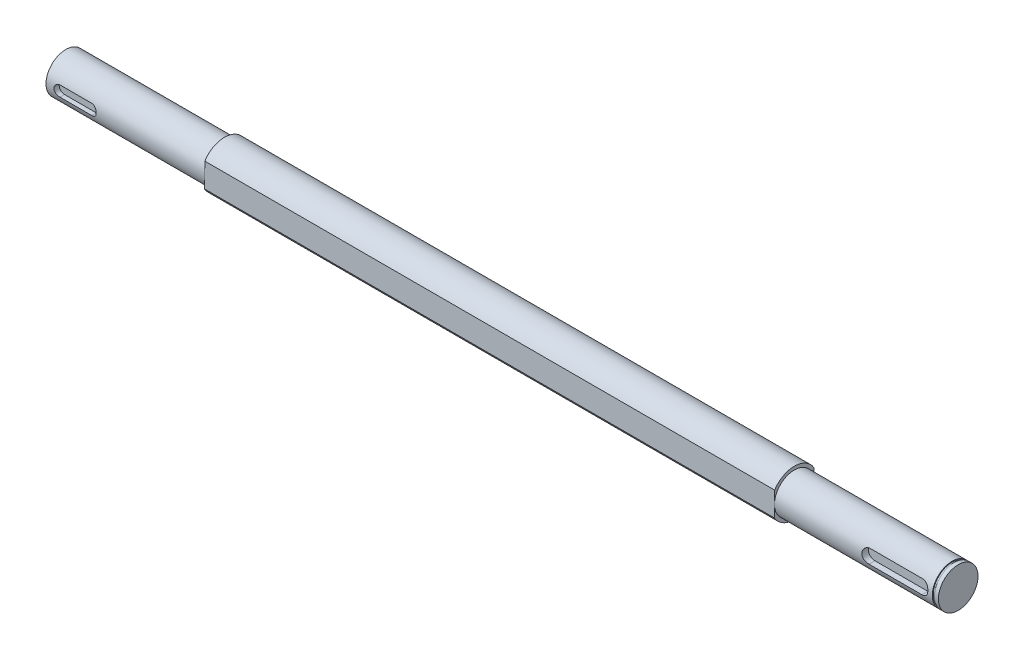
ISO-10303-21;
HEADER;
FILE_DESCRIPTION(('STEP AP214'),'2;1');
FILE_NAME('part.step','',(''),(''),'','','');
FILE_SCHEMA(('AUTOMOTIVE_DESIGN { 1 0 10303 214 1 1 1 1 }'));
ENDSEC;
DATA;
#1=APPLICATION_CONTEXT('core data for automotive mechanical design processes');
#2=APPLICATION_PROTOCOL_DEFINITION('international standard','automotive_design',2000,#1);
#3=PRODUCT_CONTEXT('',#1,'mechanical');
#4=PRODUCT('Part','Part','',(#3));
#5=PRODUCT_RELATED_PRODUCT_CATEGORY('part','',(#4));
#6=PRODUCT_DEFINITION_FORMATION('','',#4);
#7=PRODUCT_DEFINITION_CONTEXT('part definition',#1,'design');
#8=PRODUCT_DEFINITION('design','',#6,#7);
#9=PRODUCT_DEFINITION_SHAPE('','',#8);
#10=(LENGTH_UNIT() NAMED_UNIT(*) SI_UNIT(.MILLI.,.METRE.));
#11=(NAMED_UNIT(*) PLANE_ANGLE_UNIT() SI_UNIT($,.RADIAN.));
#12=(NAMED_UNIT(*) SI_UNIT($,.STERADIAN.) SOLID_ANGLE_UNIT());
#13=UNCERTAINTY_MEASURE_WITH_UNIT(LENGTH_MEASURE(1.E-05),#10,'distance_accuracy_value','');
#14=(GEOMETRIC_REPRESENTATION_CONTEXT(3) GLOBAL_UNCERTAINTY_ASSIGNED_CONTEXT((#13)) GLOBAL_UNIT_ASSIGNED_CONTEXT((#10,
#11,#12)) REPRESENTATION_CONTEXT('',''));
#15=CARTESIAN_POINT('',(0.,0.,0.));
#16=DIRECTION('',(0.,0.,1.));
#17=DIRECTION('',(1.,0.,0.));
#18=AXIS2_PLACEMENT_3D('',#15,#16,#17);
#19=CARTESIAN_POINT('',(-337.5,0.,0.));
#20=DIRECTION('',(-1.,0.,0.));
#21=DIRECTION('',(0.,0.,1.));
#22=AXIS2_PLACEMENT_3D('',#19,#20,#21);
#23=CYLINDRICAL_SURFACE('',#22,15.);
#24=DIRECTION('',(-1.,0.,0.));
#25=VECTOR('',#24,1.);
#26=CARTESIAN_POINT('',(-337.5,6.07346209048686,13.7154313907882));
#27=LINE('',#26,#25);
#28=CARTESIAN_POINT('',(284.5,6.07346209048698,13.7154313907882));
#29=VERTEX_POINT('',#28);
#30=CARTESIAN_POINT('',(324.5,6.07346209048699,13.7154313907882));
#31=VERTEX_POINT('',#30);
#32=EDGE_CURVE('E11',#29,#31,#27,.F.);
#33=ORIENTED_EDGE('',*,*,#32,.T.);
#34=CARTESIAN_POINT('',(324.5,6.07346209048699,13.7154313907882));
#35=CARTESIAN_POINT('',(324.63397390101,6.07348327762491,13.7154062533815));
#36=CARTESIAN_POINT('',(324.767936708805,6.06807834899583,13.7178149962337));
#37=CARTESIAN_POINT('',(325.034787208223,6.04657548103928,13.7273150361647));
#38=CARTESIAN_POINT('',(325.167675270867,6.03048140654111,13.7344046407987));
#39=CARTESIAN_POINT('',(325.430910167511,5.98784210482447,13.7530452271479));
#40=CARTESIAN_POINT('',(325.561264858577,5.96133765389236,13.7645787990248));
#41=CARTESIAN_POINT('',(325.819047565071,5.89816150830781,13.7917685576566));
#42=CARTESIAN_POINT('',(325.946475417137,5.86148924762141,13.8074249739244));
#43=CARTESIAN_POINT('',(326.197408000689,5.77837952891055,13.8424114610613));
#44=CARTESIAN_POINT('',(326.320917453775,5.73195438064666,13.8617368980857));
#45=CARTESIAN_POINT('',(326.563449660923,5.62972384677214,13.9035700128413));
#46=CARTESIAN_POINT('',(326.682470710043,5.57391493977371,13.9260788846957));
#47=CARTESIAN_POINT('',(327.031871185769,5.39299091630569,13.9975883158106));
#48=CARTESIAN_POINT('',(327.254620006512,5.25436778861608,14.0505763795512));
#49=CARTESIAN_POINT('',(327.685345247123,4.93724410614138,14.1652190662002));
#50=CARTESIAN_POINT('',(327.892006404643,4.75708243836331,14.2271763233824));
#51=CARTESIAN_POINT('',(328.273197368096,4.36550334842678,14.3521593684566));
#52=CARTESIAN_POINT('',(328.447718628643,4.15407764061873,14.4151854356743));
#53=CARTESIAN_POINT('',(328.686248174579,3.81137054542829,14.5082236522007));
#54=CARTESIAN_POINT('',(328.76348074474,3.68948929235013,14.5397492191822));
#55=CARTESIAN_POINT('',(328.907288704926,3.43917727179319,14.600980233659));
#56=CARTESIAN_POINT('',(328.973868145512,3.31074901823988,14.6306863702781));
#57=CARTESIAN_POINT('',(329.095833659755,3.04812354452185,14.6876481620985));
#58=CARTESIAN_POINT('',(329.15121679805,2.91392482265301,14.714903173645));
#59=CARTESIAN_POINT('',(329.250229626181,2.64075597247062,14.7663709045727));
#60=CARTESIAN_POINT('',(329.293864674975,2.50178805238237,14.7905850083829));
#61=CARTESIAN_POINT('',(329.367918565888,2.22388784242729,14.8348770546835));
#62=CARTESIAN_POINT('',(329.398665752866,2.08505819530652,14.8550498842601));
#63=CARTESIAN_POINT('',(329.448260534397,1.80486417807092,14.8916894990029));
#64=CARTESIAN_POINT('',(329.467113199592,1.66350091450559,14.9081578614567));
#65=CARTESIAN_POINT('',(329.492677109391,1.37928988887817,14.9371336286685));
#66=CARTESIAN_POINT('',(329.499389550553,1.23644227451168,14.9496414236852));
#67=CARTESIAN_POINT('',(329.500530779767,0.950399164494554,14.9705478223897));
#68=CARTESIAN_POINT('',(329.494960106692,0.80720368438044,14.9789466063241));
#69=CARTESIAN_POINT('',(329.472170592692,0.529554929067513,14.9912575695987));
#70=CARTESIAN_POINT('',(329.455613930798,0.395056693902908,14.995392463877));
#71=CARTESIAN_POINT('',(329.411615360571,0.127741225704569,15.0000518958352));
#72=CARTESIAN_POINT('',(329.384169785387,-0.00507542549082582,15.0005752162212));
#73=CARTESIAN_POINT('',(329.31860446569,-0.267953251567552,14.9981823472836));
#74=CARTESIAN_POINT('',(329.280489239476,-0.398015567809234,14.9952676122046));
#75=CARTESIAN_POINT('',(329.193853148098,-0.654565888931034,14.9862612394174));
#76=CARTESIAN_POINT('',(329.145328389829,-0.78105253644593,14.9801684118971));
#77=CARTESIAN_POINT('',(329.038726292522,-1.02842834374799,14.9652115340912));
#78=CARTESIAN_POINT('',(328.980737347695,-1.14935715173861,14.9563725010687));
#79=CARTESIAN_POINT('',(328.855309160377,-1.38605591592293,14.9362968441077));
#80=CARTESIAN_POINT('',(328.787866474987,-1.50182397231918,14.9250593459045));
#81=CARTESIAN_POINT('',(328.644033706292,-1.72740840446943,14.9006352525698));
#82=CARTESIAN_POINT('',(328.567645436313,-1.83722597984349,14.8874490523107));
#83=CARTESIAN_POINT('',(328.406392956105,-2.05031018947433,14.8596022727532));
#84=CARTESIAN_POINT('',(328.321525728456,-2.15357447006848,14.8449411685655));
#85=CARTESIAN_POINT('',(328.140651276199,-2.35652303884617,14.8141052412284));
#86=CARTESIAN_POINT('',(328.04435150837,-2.45594132518163,14.7978947897712));
#87=CARTESIAN_POINT('',(327.843886378942,-2.64642265254299,14.76501917081));
#88=CARTESIAN_POINT('',(327.73972084663,-2.73748551213487,14.7483539934422));
#89=CARTESIAN_POINT('',(327.5241390041,-2.91072082375132,14.7151448690884));
#90=CARTESIAN_POINT('',(327.412719217876,-2.99288896275022,14.6986009845097));
#91=CARTESIAN_POINT('',(327.183419867787,-3.14772131086452,14.6662233035419));
#92=CARTESIAN_POINT('',(327.065542542411,-3.22038878414664,14.6503892645045));
#93=CARTESIAN_POINT('',(326.821155725268,-3.35737561904632,14.619612757094));
#94=CARTESIAN_POINT('',(326.694507342702,-3.42145428825104,14.604700594995));
#95=CARTESIAN_POINT('',(326.436097774172,-3.53865734773634,14.5767463536471));
#96=CARTESIAN_POINT('',(326.304338569296,-3.59178593311977,14.5637035588077));
#97=CARTESIAN_POINT('',(326.036694844724,-3.68665437451773,14.539978453634));
#98=CARTESIAN_POINT('',(325.90081379756,-3.72840353663466,14.5292942158374));
#99=CARTESIAN_POINT('',(325.625865173295,-3.80020293341515,14.5106796930534));
#100=CARTESIAN_POINT('',(325.486798878599,-3.83025779158589,14.5027483198165));
#101=CARTESIAN_POINT('',(325.206888062657,-3.87834565476554,14.4899651215116));
#102=CARTESIAN_POINT('',(325.066050058997,-3.89641414305164,14.4851042090135));
#103=CARTESIAN_POINT('',(324.783476169546,-3.92051158837772,14.478591557935));
#104=CARTESIAN_POINT('',(324.641741834469,-3.92655752872573,14.4769352924912));
#105=CARTESIAN_POINT('',(324.5,-3.92653790951302,14.4769575548579));
#106=B_SPLINE_CURVE_WITH_KNOTS('',3,(#34,#35,#36,#37,#38,#39,#40,#41,#42,#43,#44,#45,#46,#47,
#48,#49,#50,#51,#52,#53,#54,#55,#56,#57,#58,#59,#60,#61,#62,#63,#64,#65,#66,#67,#68,#69,#70,#71,
#72,#73,#74,#75,#76,#77,#78,#79,#80,#81,#82,#83,#84,#85,#86,#87,#88,#89,#90,#91,#92,#93,#94,#95,
#96,#97,#98,#99,#100,#101,#102,#103,#104,#105),.UNSPECIFIED.,.F.,.F.,(4,2,2,2,2,2,2,2,2,2,2,2,2,
2,2,2,2,2,2,2,2,2,2,2,2,2,2,2,2,2,2,2,2,2,2,4),(0.,0.401773674154507,0.803402159724577,
1.20347295233272,1.60356602104035,2.00315710777569,2.40289848274697,3.20228002737228,
4.04205587850075,4.88205468867431,5.32468966588152,5.76715594131654,6.20973806924895,
6.65211796741768,7.08241831429803,7.51253509968848,7.94260948986661,8.37266501262683,
8.77890341007262,9.18527872494398,9.59148221091818,9.99783788031844,10.4005952221775,
10.8034996246409,11.206322496828,11.6092892363589,12.0268828614083,12.4444855521544,
12.8622898387131,13.2799501998937,13.7075807762128,14.135047216563,14.5621630183906,
14.9891097819882,15.4147869460964,15.8398623611671),.UNSPECIFIED.);
#107=CARTESIAN_POINT('',(324.5,-3.92653790951302,14.4769575548579));
#108=VERTEX_POINT('',#107);
#109=EDGE_CURVE('E299',#31,#108,#106,.T.);
#110=ORIENTED_EDGE('',*,*,#109,.T.);
#111=DIRECTION('',(-1.,0.,0.));
#112=VECTOR('',#111,1.);
#113=CARTESIAN_POINT('',(-337.5,-3.926537909513,14.4769575548579));
#114=LINE('',#113,#112);
#115=CARTESIAN_POINT('',(284.5,-3.926537909513,14.4769575548579));
#116=VERTEX_POINT('',#115);
#117=EDGE_CURVE('E41',#108,#116,#114,.T.);
#118=ORIENTED_EDGE('',*,*,#117,.T.);
#119=CARTESIAN_POINT('',(284.5,-3.92653790951301,14.4769575548579));
#120=CARTESIAN_POINT('',(284.361727269552,-3.92655559321679,14.4769374121292));
#121=CARTESIAN_POINT('',(284.223461239682,-3.92080285925546,14.4785126079107));
#122=CARTESIAN_POINT('',(283.947972881751,-3.89788777293455,14.4847067717097));
#123=CARTESIAN_POINT('',(283.810750353851,-3.88072766382228,14.489325141289));
#124=CARTESIAN_POINT('',(283.538619028268,-3.83517830673964,14.5014457212058));
#125=CARTESIAN_POINT('',(283.403705864787,-3.80681344874412,14.5089416667773));
#126=CARTESIAN_POINT('',(283.136840877484,-3.73909939940248,14.5265400633516));
#127=CARTESIAN_POINT('',(283.004889114713,-3.69974998182712,14.5366425680367));
#128=CARTESIAN_POINT('',(282.744900306645,-3.6103936282383,14.5590925215626));
#129=CARTESIAN_POINT('',(282.616861570745,-3.56039137134037,14.5714389844264));
#130=CARTESIAN_POINT('',(282.365470167761,-3.45010448620057,14.5979447565759));
#131=CARTESIAN_POINT('',(282.242119264388,-3.38981603388898,14.612104739579));
#132=CARTESIAN_POINT('',(281.880325765066,-3.19413027173053,14.656584323116));
#133=CARTESIAN_POINT('',(281.649963710719,-3.04385086351598,14.6889200615283));
#134=CARTESIAN_POINT('',(281.212268709328,-2.70402396012244,14.7552974648505));
#135=CARTESIAN_POINT('',(281.005566892805,-2.51367256445746,14.7893611153551));
#136=CARTESIAN_POINT('',(280.626579987665,-2.10067091683774,14.8536453825651));
#137=CARTESIAN_POINT('',(280.454297984271,-1.87801777259714,14.8838656546807));
#138=CARTESIAN_POINT('',(280.148168925702,-1.40473953029504,14.93598521089));
#139=CARTESIAN_POINT('',(280.014570848697,-1.15394704595174,14.9578308732902));
#140=CARTESIAN_POINT('',(279.791579084805,-0.632717591975507,14.9889190272426));
#141=CARTESIAN_POINT('',(279.702170573763,-0.362287245168827,14.9981657471599));
#142=CARTESIAN_POINT('',(279.572889591642,0.179909085188166,15.0012815453548));
#143=CARTESIAN_POINT('',(279.531342720391,0.451273131997974,14.9956946168802));
#144=CARTESIAN_POINT('',(279.493135633023,0.996388663949028,14.9693562813771));
#145=CARTESIAN_POINT('',(279.496470229669,1.27013986953643,14.9486066270634));
#146=CARTESIAN_POINT('',(279.546795253633,1.80601590119188,14.8932649280141));
#147=CARTESIAN_POINT('',(279.5928324717,2.06826408532214,14.8589844840154));
#148=CARTESIAN_POINT('',(279.725176924418,2.5804710316093,14.7786480434589));
#149=CARTESIAN_POINT('',(279.811489811818,2.83042806323992,14.7325903943637));
#150=CARTESIAN_POINT('',(280.024990950211,3.32024332718324,14.630129344542));
#151=CARTESIAN_POINT('',(280.153446368116,3.55948677753561,14.5734321450122));
#152=CARTESIAN_POINT('',(280.446544743179,4.01328763565505,14.4550553762692));
#153=CARTESIAN_POINT('',(280.611200778533,4.22783607907038,14.3933740115332));
#154=CARTESIAN_POINT('',(280.983047315308,4.63883873051916,14.2663924034092));
#155=CARTESIAN_POINT('',(281.192089745599,4.83363052536352,14.2010811000783));
#156=CARTESIAN_POINT('',(281.528828599302,5.09746160983885,14.1076098456609));
#157=CARTESIAN_POINT('',(281.645029365405,5.18072887207762,14.0771817779138));
#158=CARTESIAN_POINT('',(281.884522072694,5.33722825343147,14.0185933123181));
#159=CARTESIAN_POINT('',(282.007810929483,5.41046469125175,13.9904319407256));
#160=CARTESIAN_POINT('',(282.261012719932,5.54645213857724,13.937080903227));
#161=CARTESIAN_POINT('',(282.390939557256,5.60917985463073,13.9118978744393));
#162=CARTESIAN_POINT('',(282.656253753039,5.72334824134947,13.8653195340362));
#163=CARTESIAN_POINT('',(282.791638543552,5.77479414835522,13.8439224660989));
#164=CARTESIAN_POINT('',(283.066736988415,5.86582245161966,13.8055991420844));
#165=CARTESIAN_POINT('',(283.206444059161,5.90542199663724,13.7886664276804));
#166=CARTESIAN_POINT('',(283.489202891622,5.9723786625468,13.7597972592891));
#167=CARTESIAN_POINT('',(283.632252810433,5.99974236894941,13.7478581179106));
#168=CARTESIAN_POINT('',(283.896051575474,6.03832556667167,13.7309506152103));
#169=CARTESIAN_POINT('',(284.01646505765,6.05149678498338,13.7251431045586));
#170=CARTESIAN_POINT('',(284.257914186845,6.06906637397555,13.7173777140436));
#171=CARTESIAN_POINT('',(284.378948965867,6.07347475041513,13.7154154435694));
#172=CARTESIAN_POINT('',(284.5,6.07346209048698,13.7154313907882));
#173=B_SPLINE_CURVE_WITH_KNOTS('',3,(#119,#120,#121,#122,#123,#124,#125,#126,#127,#128,#129,
#130,#131,#132,#133,#134,#135,#136,#137,#138,#139,#140,#141,#142,#143,#144,#145,#146,#147,#148,
#149,#150,#151,#152,#153,#154,#155,#156,#157,#158,#159,#160,#161,#162,#163,#164,#165,#166,#167,
#168,#169,#170,#171,#172),.UNSPECIFIED.,.F.,.F.,(4,2,2,2,2,2,2,2,2,2,2,2,2,2,2,2,2,2,2,2,2,2,2,
2,2,2,4),(0.,0.414679204591292,0.829276887103151,1.24297702226714,1.65668567829824,
2.07021299166737,2.48389437724065,3.31069483290199,4.15600798358966,5.0013968700526,
5.85211170905448,6.70254096696643,7.52221707049838,8.34179843966596,9.14351429326244,
9.94534270270342,10.7739114656597,11.6027800589483,12.4775978429818,12.9156373850444,
13.3534877352184,13.7922961313973,14.2309004258789,14.6688666910368,15.106596951665,
15.4700395242264,15.8330668647638),.UNSPECIFIED.);
#174=EDGE_CURVE('E48',#116,#29,#173,.T.);
#175=ORIENTED_EDGE('',*,*,#174,.T.);
#176=EDGE_LOOP('',(#33,#110,#118,#175));
#177=FACE_BOUND('',#176,.T.);
#178=CARTESIAN_POINT('',(332.9,0.,0.));
#179=DIRECTION('',(1.,0.,0.));
#180=DIRECTION('',(0.,0.,-1.));
#181=AXIS2_PLACEMENT_3D('',#178,#179,#180);
#182=CIRCLE('',#181,15.);
#183=CARTESIAN_POINT('',(332.9,0.,-15.));
#184=VERTEX_POINT('',#183);
#185=EDGE_CURVE('E162',#184,#184,#182,.T.);
#186=ORIENTED_EDGE('',*,*,#185,.F.);
#187=EDGE_LOOP('',(#186));
#188=FACE_BOUND('',#187,.T.);
#189=CARTESIAN_POINT('',(213.5,0.,0.));
#190=DIRECTION('',(-1.,0.,0.));
#191=DIRECTION('',(0.,0.,1.));
#192=AXIS2_PLACEMENT_3D('',#189,#190,#191);
#193=CIRCLE('',#192,15.);
#194=CARTESIAN_POINT('',(213.5,0.25612963538557,14.997813094244));
#195=VERTEX_POINT('',#194);
#196=CARTESIAN_POINT('',(213.5,0.25612963538557,-14.997813094244));
#197=VERTEX_POINT('',#196);
#198=EDGE_CURVE('E226',#195,#197,#193,.T.);
#199=ORIENTED_EDGE('',*,*,#198,.F.);
#200=EDGE_CURVE('E225',#197,#195,#193,.T.);
#201=ORIENTED_EDGE('',*,*,#200,.F.);
#202=EDGE_LOOP('',(#199,#201));
#203=FACE_BOUND('',#202,.T.);
#204=ADVANCED_FACE('F33',(#177,#188,#203),#23,.T.);
#205=CARTESIAN_POINT('',(-217.5,15.,0.));
#206=DIRECTION('',(1.,0.,0.));
#207=DIRECTION('',(0.,0.,-1.));
#208=AXIS2_PLACEMENT_3D('',#205,#206,#207);
#209=PLANE('',#208);
#210=CARTESIAN_POINT('',(-217.5,0.,0.));
#211=DIRECTION('',(-1.,0.,0.));
#212=DIRECTION('',(0.,0.,1.));
#213=AXIS2_PLACEMENT_3D('',#210,#211,#212);
#214=CIRCLE('',#213,17.5);
#215=CARTESIAN_POINT('',(-217.5,9.26869365723926,14.8438983386526));
#216=VERTEX_POINT('',#215);
#217=CARTESIAN_POINT('',(-217.5,9.26869365723926,-14.8438983386526));
#218=VERTEX_POINT('',#217);
#219=EDGE_CURVE('E234',#216,#218,#214,.T.);
#220=ORIENTED_EDGE('',*,*,#219,.T.);
#221=DIRECTION('',(0.,0.999854206282934,0.0170753090257047));
#222=VECTOR('',#221,1.);
#223=CARTESIAN_POINT('',(-217.5,9.26869365723926,-14.8438983386526));
#224=LINE('',#223,#222);
#225=CARTESIAN_POINT('',(-217.5,0.25612963538557,-14.997813094244));
#226=VERTEX_POINT('',#225);
#227=EDGE_CURVE('E204',#226,#218,#224,.T.);
#228=ORIENTED_EDGE('',*,*,#227,.F.);
#229=CARTESIAN_POINT('',(-217.5,0.,0.));
#230=DIRECTION('',(-1.,0.,0.));
#231=DIRECTION('',(0.,0.,1.));
#232=AXIS2_PLACEMENT_3D('',#229,#230,#231);
#233=CIRCLE('',#232,15.);
#234=CARTESIAN_POINT('',(-217.5,0.25612963538557,14.997813094244));
#235=VERTEX_POINT('',#234);
#236=EDGE_CURVE('E238',#235,#226,#233,.T.);
#237=ORIENTED_EDGE('',*,*,#236,.F.);
#238=DIRECTION('',(0.,-0.999854206282934,0.0170753090257047));
#239=VECTOR('',#238,1.);
#240=CARTESIAN_POINT('',(-217.5,9.26869365723926,14.8438983386526));
#241=LINE('',#240,#239);
#242=EDGE_CURVE('E213',#216,#235,#241,.T.);
#243=ORIENTED_EDGE('',*,*,#242,.F.);
#244=EDGE_LOOP('',(#220,#228,#237,#243));
#245=FACE_BOUND('',#244,.T.);
#246=ADVANCED_FACE('F332',(#245),#209,.F.);
#247=CARTESIAN_POINT('',(-337.5,0.,0.));
#248=DIRECTION('',(-1.,0.,0.));
#249=DIRECTION('',(0.,0.,1.));
#250=AXIS2_PLACEMENT_3D('',#247,#248,#249);
#251=CYLINDRICAL_SURFACE('',#250,17.5);
#252=CARTESIAN_POINT('',(213.5,0.,0.));
#253=DIRECTION('',(-1.,0.,0.));
#254=DIRECTION('',(0.,0.,1.));
#255=AXIS2_PLACEMENT_3D('',#252,#253,#254);
#256=CIRCLE('',#255,17.5);
#257=CARTESIAN_POINT('',(213.5,9.26869365723933,14.8438983386526));
#258=VERTEX_POINT('',#257);
#259=CARTESIAN_POINT('',(213.5,9.26869365723927,-14.8438983386526));
#260=VERTEX_POINT('',#259);
#261=EDGE_CURVE('E230',#258,#260,#256,.T.);
#262=ORIENTED_EDGE('',*,*,#261,.T.);
#263=DIRECTION('',(-1.,0.,0.));
#264=VECTOR('',#263,1.);
#265=CARTESIAN_POINT('',(231.719772694176,9.26869365723933,-14.8438983386526));
#266=LINE('',#265,#264);
#267=EDGE_CURVE('E205',#260,#218,#266,.T.);
#268=ORIENTED_EDGE('',*,*,#267,.T.);
#269=ORIENTED_EDGE('',*,*,#219,.F.);
#270=DIRECTION('',(-1.,0.,0.));
#271=VECTOR('',#270,1.);
#272=CARTESIAN_POINT('',(231.719772694176,9.26869365723933,14.8438983386526));
#273=LINE('',#272,#271);
#274=EDGE_CURVE('E215',#258,#216,#273,.T.);
#275=ORIENTED_EDGE('',*,*,#274,.F.);
#276=EDGE_LOOP('',(#262,#268,#269,#275));
#277=FACE_BOUND('',#276,.T.);
#278=ADVANCED_FACE('F337',(#277),#251,.T.);
#279=CARTESIAN_POINT('',(213.5,17.5,0.));
#280=DIRECTION('',(-1.,0.,0.));
#281=DIRECTION('',(0.,0.,1.));
#282=AXIS2_PLACEMENT_3D('',#279,#280,#281);
#283=PLANE('',#282);
#284=CARTESIAN_POINT('',(213.5,-8.75643438646803,-15.1517278498354));
#285=VERTEX_POINT('',#284);
#286=CARTESIAN_POINT('',(213.5,-8.75643438646813,15.1517278498355));
#287=VERTEX_POINT('',#286);
#288=EDGE_CURVE('E229',#285,#287,#256,.T.);
#289=ORIENTED_EDGE('',*,*,#288,.F.);
#290=DIRECTION('',(0.,-0.999854206282935,-0.0170753090257047));
#291=VECTOR('',#290,1.);
#292=CARTESIAN_POINT('',(213.5,9.26869365723933,-14.8438983386526));
#293=LINE('',#292,#291);
#294=EDGE_CURVE('E208',#197,#285,#293,.T.);
#295=ORIENTED_EDGE('',*,*,#294,.F.);
#296=ORIENTED_EDGE('',*,*,#200,.T.);
#297=DIRECTION('',(0.,0.999854206282935,-0.0170753090257047));
#298=VECTOR('',#297,1.);
#299=CARTESIAN_POINT('',(213.5,9.26869365723933,14.8438983386526));
#300=LINE('',#299,#298);
#301=EDGE_CURVE('E221',#287,#195,#300,.T.);
#302=ORIENTED_EDGE('',*,*,#301,.F.);
#303=EDGE_LOOP('',(#289,#295,#296,#302));
#304=FACE_BOUND('',#303,.T.);
#305=ADVANCED_FACE('F356',(#304),#283,.F.);
#306=CARTESIAN_POINT('',(-337.5,0.,0.));
#307=DIRECTION('',(1.,0.,0.));
#308=DIRECTION('',(0.,0.,-1.));
#309=AXIS2_PLACEMENT_3D('',#306,#307,#308);
#310=PLANE('',#309);
#311=CARTESIAN_POINT('',(-337.5,0.,0.));
#312=DIRECTION('',(-1.,0.,0.));
#313=DIRECTION('',(0.,0.,1.));
#314=AXIS2_PLACEMENT_3D('',#311,#312,#313);
#315=CIRCLE('',#314,15.);
#316=CARTESIAN_POINT('',(-337.5,0.,15.));
#317=VERTEX_POINT('',#316);
#318=EDGE_CURVE('E241',#317,#317,#315,.T.);
#319=ORIENTED_EDGE('',*,*,#318,.T.);
#320=EDGE_LOOP('',(#319));
#321=FACE_BOUND('',#320,.T.);
#322=ADVANCED_FACE('F35',(#321),#310,.F.);
#323=CARTESIAN_POINT('',(-337.5,0.,0.));
#324=DIRECTION('',(-1.,0.,0.));
#325=DIRECTION('',(0.,0.,1.));
#326=AXIS2_PLACEMENT_3D('',#323,#324,#325);
#327=CYLINDRICAL_SURFACE('',#326,15.);
#328=DIRECTION('',(-1.,0.,0.));
#329=VECTOR('',#328,1.);
#330=CARTESIAN_POINT('',(-337.5,4.,14.4568322948009));
#331=LINE('',#330,#329);
#332=CARTESIAN_POINT('',(-327.5,4.,14.4568322948009));
#333=VERTEX_POINT('',#332);
#334=CARTESIAN_POINT('',(-303.5,4.,14.4568322948009));
#335=VERTEX_POINT('',#334);
#336=EDGE_CURVE('E392',#333,#335,#331,.F.);
#337=ORIENTED_EDGE('',*,*,#336,.T.);
#338=CARTESIAN_POINT('',(-303.5,4.,14.4568322948009));
#339=CARTESIAN_POINT('',(-303.389641756596,4.00001309389174,14.4568189842467));
#340=CARTESIAN_POINT('',(-303.279291478007,3.99543311151603,14.4580956467716));
#341=CARTESIAN_POINT('',(-303.059421346034,3.97718874589725,14.4631301353516));
#342=CARTESIAN_POINT('',(-302.94990134224,3.96352604983924,14.4668875005959));
#343=CARTESIAN_POINT('',(-302.732698346486,3.92725695741262,14.4767740441058));
#344=CARTESIAN_POINT('',(-302.625011912151,3.90466984692445,14.4828981072579));
#345=CARTESIAN_POINT('',(-302.412025139644,3.85076543838183,14.4973231400467));
#346=CARTESIAN_POINT('',(-302.306724843414,3.81944798699436,14.5056241479174));
#347=CARTESIAN_POINT('',(-301.995536581224,3.71275643853686,14.5334412456827));
#348=CARTESIAN_POINT('',(-301.794125066452,3.62460332607936,14.5558829598251));
#349=CARTESIAN_POINT('',(-301.408979240374,3.41695780475821,14.6060171290377));
#350=CARTESIAN_POINT('',(-301.225250796027,3.29745504324307,14.6337113178034));
#351=CARTESIAN_POINT('',(-300.876029423072,3.0273032087801,14.6920016406366));
#352=CARTESIAN_POINT('',(-300.711038159034,2.87601544465619,14.7226489452442));
#353=CARTESIAN_POINT('',(-300.408442433038,2.54795832924029,14.7829523618628));
#354=CARTESIAN_POINT('',(-300.270842417131,2.3711848492125,14.8126083123117));
#355=CARTESIAN_POINT('',(-300.024827869814,1.99367199592158,14.8681604116921));
#356=CARTESIAN_POINT('',(-299.916916034421,1.79259414843398,14.8939887414057));
#357=CARTESIAN_POINT('',(-299.736627111038,1.37435575552791,14.9383834129135));
#358=CARTESIAN_POINT('',(-299.664242355223,1.15719869214847,14.9569513215518));
#359=CARTESIAN_POINT('',(-299.55869017483,0.718234307369668,14.9843709217852));
#360=CARTESIAN_POINT('',(-299.524662787106,0.496647293428103,14.9934353394137));
#361=CARTESIAN_POINT('',(-299.494085686777,0.0507319917605744,15.0015705103632));
#362=CARTESIAN_POINT('',(-299.497530515807,-0.173595891963458,15.0006427191926));
#363=CARTESIAN_POINT('',(-299.541195686368,-0.612629502642175,14.9890534931376));
#364=CARTESIAN_POINT('',(-299.580486127656,-0.827435206418331,14.9786381919442));
#365=CARTESIAN_POINT('',(-299.693225150863,-1.24728467665106,14.9495347795912));
#366=CARTESIAN_POINT('',(-299.76667535215,-1.45232797980576,14.9308462762363));
#367=CARTESIAN_POINT('',(-299.946359966253,-1.84920963545356,14.8869312076944));
#368=CARTESIAN_POINT('',(-300.05291337223,-2.04089626466617,14.8616414267933));
#369=CARTESIAN_POINT('',(-300.295542768964,-2.40398441957149,14.8072486052897));
#370=CARTESIAN_POINT('',(-300.431623922183,-2.57538239000352,14.7781448982353));
#371=CARTESIAN_POINT('',(-300.734327971101,-2.89854935036781,14.7182294237972));
#372=CARTESIAN_POINT('',(-300.901758007894,-3.04955722400808,14.6873926412643));
#373=CARTESIAN_POINT('',(-301.260042840709,-3.32161448391782,14.6282716207251));
#374=CARTESIAN_POINT('',(-301.450904096481,-3.4426555807802,14.5999880903709));
#375=CARTESIAN_POINT('',(-301.751353283364,-3.59932937334135,14.5618587427771));
#376=CARTESIAN_POINT('',(-301.854288915041,-3.6475437194535,14.5498268172621));
#377=CARTESIAN_POINT('',(-302.064046321271,-3.73509417643329,14.5275984074125));
#378=CARTESIAN_POINT('',(-302.170866512463,-3.77443385857865,14.5174011851057));
#379=CARTESIAN_POINT('',(-302.38751941922,-3.84386783810502,14.4991713081511));
#380=CARTESIAN_POINT('',(-302.497348878193,-3.87397173088607,14.4911364080612));
#381=CARTESIAN_POINT('',(-302.719275221125,-3.92471856960777,14.4774747012191));
#382=CARTESIAN_POINT('',(-302.83137102282,-3.94536592495321,14.4718467722231));
#383=CARTESIAN_POINT('',(-303.036251024718,-3.97411378733403,14.4639761334309));
#384=CARTESIAN_POINT('',(-303.128796446167,-3.98382319960777,14.4613012625133));
#385=CARTESIAN_POINT('',(-303.31422535331,-3.99676420153355,14.4577275048596));
#386=CARTESIAN_POINT('',(-303.407108070432,-4.00000603663184,14.4568258092259));
#387=CARTESIAN_POINT('',(-303.5,-4.,14.4568322948009));
#388=B_SPLINE_CURVE_WITH_KNOTS('',3,(#338,#339,#340,#341,#342,#343,#344,#345,#346,#347,#348,
#349,#350,#351,#352,#353,#354,#355,#356,#357,#358,#359,#360,#361,#362,#363,#364,#365,#366,#367,
#368,#369,#370,#371,#372,#373,#374,#375,#376,#377,#378,#379,#380,#381,#382,#383,#384,#385,#386,
#387),.UNSPECIFIED.,.F.,.F.,(4,2,2,2,2,2,2,2,2,2,2,2,2,2,2,2,2,2,2,2,2,2,2,2,4),(0.,
0.330958670878051,0.66185588076851,0.99204189068868,1.32223370010826,1.98190700187175,
2.64179842357632,3.31649637536146,3.99130375261115,4.67691814590523,5.36238449759351,
6.03215661862343,6.7018311790669,7.35461236515046,8.00742449996359,8.66673340793704,
9.32615767867958,10.0057598785669,10.6855498604333,11.0281077435252,11.3705275300852,
11.7125903499583,12.0544935096115,12.3335333037377,12.6121307120355),.UNSPECIFIED.);
#389=CARTESIAN_POINT('',(-303.5,-4.,14.4568322948009));
#390=VERTEX_POINT('',#389);
#391=EDGE_CURVE('E244',#335,#390,#388,.T.);
#392=ORIENTED_EDGE('',*,*,#391,.T.);
#393=DIRECTION('',(-1.,0.,0.));
#394=VECTOR('',#393,1.);
#395=CARTESIAN_POINT('',(-337.5,-4.,14.4568322948009));
#396=LINE('',#395,#394);
#397=CARTESIAN_POINT('',(-327.5,-4.,14.4568322948009));
#398=VERTEX_POINT('',#397);
#399=EDGE_CURVE('E397',#390,#398,#396,.T.);
#400=ORIENTED_EDGE('',*,*,#399,.T.);
#401=CARTESIAN_POINT('',(-327.5,-4.,14.4568322948009));
#402=CARTESIAN_POINT('',(-327.610358243404,-4.00001309389174,14.4568189842467));
#403=CARTESIAN_POINT('',(-327.720708521993,-3.99543311151603,14.4580956467716));
#404=CARTESIAN_POINT('',(-327.940578653966,-3.97718874589725,14.4631301353516));
#405=CARTESIAN_POINT('',(-328.050098657759,-3.96352604983924,14.4668875005959));
#406=CARTESIAN_POINT('',(-328.267301653514,-3.92725695741263,14.4767740441058));
#407=CARTESIAN_POINT('',(-328.374988087848,-3.90466984692447,14.4828981072579));
#408=CARTESIAN_POINT('',(-328.587974860355,-3.85076543838186,14.4973231400467));
#409=CARTESIAN_POINT('',(-328.693275156585,-3.81944798699438,14.5056241479174));
#410=CARTESIAN_POINT('',(-329.004463418775,-3.71275643853687,14.5334412456827));
#411=CARTESIAN_POINT('',(-329.205874933547,-3.62460332607936,14.5558829598251));
#412=CARTESIAN_POINT('',(-329.591020759626,-3.41695780475821,14.6060171290377));
#413=CARTESIAN_POINT('',(-329.774749203972,-3.29745504324307,14.6337113178034));
#414=CARTESIAN_POINT('',(-330.123970576928,-3.0273032087801,14.6920016406366));
#415=CARTESIAN_POINT('',(-330.288961840965,-2.87601544465619,14.7226489452442));
#416=CARTESIAN_POINT('',(-330.591557566961,-2.5479583292403,14.7829523618628));
#417=CARTESIAN_POINT('',(-330.729157582868,-2.37118484921251,14.8126083123117));
#418=CARTESIAN_POINT('',(-330.975172130185,-1.99367199592158,14.8681604116921));
#419=CARTESIAN_POINT('',(-331.083083965578,-1.79259414843398,14.8939887414057));
#420=CARTESIAN_POINT('',(-331.263372888961,-1.37435575552791,14.9383834129135));
#421=CARTESIAN_POINT('',(-331.335757644777,-1.15719869214847,14.9569513215518));
#422=CARTESIAN_POINT('',(-331.441309825169,-0.71823430736967,14.9843709217852));
#423=CARTESIAN_POINT('',(-331.475337212893,-0.496647293428105,14.9934353394137));
#424=CARTESIAN_POINT('',(-331.505914313223,-0.0507319917605753,15.0015705103632));
#425=CARTESIAN_POINT('',(-331.502469484192,0.173595891963458,15.0006427191926));
#426=CARTESIAN_POINT('',(-331.458804313632,0.612629502642176,14.9890534931376));
#427=CARTESIAN_POINT('',(-331.419513872343,0.827435206418333,14.9786381919442));
#428=CARTESIAN_POINT('',(-331.306774849136,1.24728467665106,14.9495347795912));
#429=CARTESIAN_POINT('',(-331.233324647849,1.45232797980576,14.9308462762363));
#430=CARTESIAN_POINT('',(-331.053640033747,1.84920963545356,14.8869312076944));
#431=CARTESIAN_POINT('',(-330.94708662777,2.04089626466618,14.8616414267933));
#432=CARTESIAN_POINT('',(-330.704457231035,2.40398441957149,14.8072486052897));
#433=CARTESIAN_POINT('',(-330.568376077817,2.57538239000352,14.7781448982353));
#434=CARTESIAN_POINT('',(-330.265672028898,2.89854935036781,14.7182294237972));
#435=CARTESIAN_POINT('',(-330.098241992105,3.04955722400808,14.6873926412643));
#436=CARTESIAN_POINT('',(-329.739957159291,3.32161448391782,14.6282716207251));
#437=CARTESIAN_POINT('',(-329.549095903519,3.4426555807802,14.5999880903709));
#438=CARTESIAN_POINT('',(-329.248646716635,3.59932937334133,14.5618587427771));
#439=CARTESIAN_POINT('',(-329.145711084959,3.64754371945346,14.5498268172621));
#440=CARTESIAN_POINT('',(-328.935953678728,3.73509417643325,14.5275984074125));
#441=CARTESIAN_POINT('',(-328.829133487537,3.77443385857862,14.5174011851057));
#442=CARTESIAN_POINT('',(-328.61248058078,3.84386783810499,14.4991713081511));
#443=CARTESIAN_POINT('',(-328.502651121807,3.87397173088602,14.4911364080612));
#444=CARTESIAN_POINT('',(-328.280724778875,3.92471856960774,14.4774747012191));
#445=CARTESIAN_POINT('',(-328.16862897718,3.9453659249532,14.4718467722231));
#446=CARTESIAN_POINT('',(-327.963748975282,3.97411378733403,14.4639761334309));
#447=CARTESIAN_POINT('',(-327.871203553832,3.98382319960777,14.4613012625133));
#448=CARTESIAN_POINT('',(-327.68577464669,3.99676420153356,14.4577275048596));
#449=CARTESIAN_POINT('',(-327.592891929567,4.00000603663184,14.4568258092259));
#450=CARTESIAN_POINT('',(-327.5,4.,14.4568322948009));
#451=B_SPLINE_CURVE_WITH_KNOTS('',3,(#401,#402,#403,#404,#405,#406,#407,#408,#409,#410,#411,
#412,#413,#414,#415,#416,#417,#418,#419,#420,#421,#422,#423,#424,#425,#426,#427,#428,#429,#430,
#431,#432,#433,#434,#435,#436,#437,#438,#439,#440,#441,#442,#443,#444,#445,#446,#447,#448,#449,
#450),.UNSPECIFIED.,.F.,.F.,(4,2,2,2,2,2,2,2,2,2,2,2,2,2,2,2,2,2,2,2,2,2,2,2,4),(0.,
0.330958670878051,0.66185588076851,0.992041890688508,1.32223370010826,1.98190700187175,
2.64179842357632,3.31649637536146,3.99130375261115,4.67691814590522,5.36238449759351,
6.03215661862343,6.7018311790669,7.35461236515046,8.0074244999636,8.66673340793705,
9.32615767867958,10.0057598785669,10.6855498604333,11.028107743525,11.3705275300852,
11.7125903499581,12.0544935096115,12.3335333037377,12.6121307120355),.UNSPECIFIED.);
#452=EDGE_CURVE('E56',#398,#333,#451,.T.);
#453=ORIENTED_EDGE('',*,*,#452,.T.);
#454=EDGE_LOOP('',(#337,#392,#400,#453));
#455=FACE_BOUND('',#454,.T.);
#456=ORIENTED_EDGE('',*,*,#318,.F.);
#457=EDGE_LOOP('',(#456));
#458=FACE_BOUND('',#457,.T.);
#459=ORIENTED_EDGE('',*,*,#236,.T.);
#460=EDGE_CURVE('E237',#226,#235,#233,.T.);
#461=ORIENTED_EDGE('',*,*,#460,.T.);
#462=EDGE_LOOP('',(#459,#461));
#463=FACE_BOUND('',#462,.T.);
#464=ADVANCED_FACE('F258',(#455,#458,#463),#327,.T.);
#465=ORIENTED_EDGE('',*,*,#460,.F.);
#466=CARTESIAN_POINT('',(-217.5,-8.75643438646803,-15.1517278498354));
#467=VERTEX_POINT('',#466);
#468=EDGE_CURVE('E201',#467,#226,#224,.T.);
#469=ORIENTED_EDGE('',*,*,#468,.F.);
#470=CARTESIAN_POINT('',(-217.5,-8.75643438646803,15.1517278498354));
#471=VERTEX_POINT('',#470);
#472=EDGE_CURVE('E233',#467,#471,#214,.T.);
#473=ORIENTED_EDGE('',*,*,#472,.T.);
#474=EDGE_CURVE('E193',#235,#471,#241,.T.);
#475=ORIENTED_EDGE('',*,*,#474,.F.);
#476=EDGE_LOOP('',(#465,#469,#473,#475));
#477=FACE_BOUND('',#476,.T.);
#478=ADVANCED_FACE('F339',(#477),#209,.F.);
#479=ORIENTED_EDGE('',*,*,#472,.F.);
#480=DIRECTION('',(-1.,0.,0.));
#481=VECTOR('',#480,1.);
#482=CARTESIAN_POINT('',(231.719772694176,-8.75643438646797,-15.1517278498354));
#483=LINE('',#482,#481);
#484=EDGE_CURVE('E203',#285,#467,#483,.T.);
#485=ORIENTED_EDGE('',*,*,#484,.F.);
#486=ORIENTED_EDGE('',*,*,#288,.T.);
#487=DIRECTION('',(-1.,0.,0.));
#488=VECTOR('',#487,1.);
#489=CARTESIAN_POINT('',(231.719772694176,-8.75643438646797,15.1517278498354));
#490=LINE('',#489,#488);
#491=EDGE_CURVE('E216',#287,#471,#490,.T.);
#492=ORIENTED_EDGE('',*,*,#491,.T.);
#493=EDGE_LOOP('',(#479,#485,#486,#492));
#494=FACE_BOUND('',#493,.T.);
#495=ADVANCED_FACE('F362',(#494),#251,.T.);
#496=ORIENTED_EDGE('',*,*,#198,.T.);
#497=EDGE_CURVE('E210',#260,#197,#293,.T.);
#498=ORIENTED_EDGE('',*,*,#497,.F.);
#499=ORIENTED_EDGE('',*,*,#261,.F.);
#500=EDGE_CURVE('E219',#195,#258,#300,.T.);
#501=ORIENTED_EDGE('',*,*,#500,.F.);
#502=EDGE_LOOP('',(#496,#498,#499,#501));
#503=FACE_BOUND('',#502,.T.);
#504=ADVANCED_FACE('F284',(#503),#283,.F.);
#505=CARTESIAN_POINT('',(231.719772694176,9.26869365723933,14.8438983386526));
#506=DIRECTION('',(0.,-0.0170753090257047,-0.999854206282934));
#507=DIRECTION('',(0.,0.999854206282935,-0.0170753090257047));
#508=AXIS2_PLACEMENT_3D('',#505,#506,#507);
#509=PLANE('',#508);
#510=ORIENTED_EDGE('',*,*,#301,.T.);
#511=ORIENTED_EDGE('',*,*,#500,.T.);
#512=ORIENTED_EDGE('',*,*,#274,.T.);
#513=ORIENTED_EDGE('',*,*,#242,.T.);
#514=ORIENTED_EDGE('',*,*,#474,.T.);
#515=ORIENTED_EDGE('',*,*,#491,.F.);
#516=EDGE_LOOP('',(#510,#511,#512,#513,#514,#515));
#517=FACE_BOUND('',#516,.T.);
#518=ADVANCED_FACE('F280',(#517),#509,.F.);
#519=CARTESIAN_POINT('',(231.719772694176,9.26869365723933,-14.8438983386526));
#520=DIRECTION('',(0.,-0.0170753090257047,0.999854206282934));
#521=DIRECTION('',(0.,-0.999854206282935,-0.0170753090257047));
#522=AXIS2_PLACEMENT_3D('',#519,#520,#521);
#523=PLANE('',#522);
#524=ORIENTED_EDGE('',*,*,#497,.T.);
#525=ORIENTED_EDGE('',*,*,#294,.T.);
#526=ORIENTED_EDGE('',*,*,#484,.T.);
#527=ORIENTED_EDGE('',*,*,#468,.T.);
#528=ORIENTED_EDGE('',*,*,#227,.T.);
#529=ORIENTED_EDGE('',*,*,#267,.F.);
#530=EDGE_LOOP('',(#524,#525,#526,#527,#528,#529));
#531=FACE_BOUND('',#530,.T.);
#532=ADVANCED_FACE('F277',(#531),#523,.F.);
#533=CARTESIAN_POINT('',(-327.5,0.,11.));
#534=DIRECTION('',(0.,0.,1.));
#535=DIRECTION('',(1.,0.,0.));
#536=AXIS2_PLACEMENT_3D('',#533,#534,#535);
#537=CYLINDRICAL_SURFACE('',#536,4.);
#538=DIRECTION('',(0.,0.,1.));
#539=VECTOR('',#538,1.);
#540=CARTESIAN_POINT('',(-327.5,-4.,11.));
#541=LINE('',#540,#539);
#542=CARTESIAN_POINT('',(-327.5,-4.,11.));
#543=VERTEX_POINT('',#542);
#544=EDGE_CURVE('E190',#543,#398,#541,.T.);
#545=ORIENTED_EDGE('',*,*,#544,.F.);
#546=CARTESIAN_POINT('',(-327.5,0.,11.));
#547=DIRECTION('',(0.,0.,1.));
#548=DIRECTION('',(1.,0.,0.));
#549=AXIS2_PLACEMENT_3D('',#546,#547,#548);
#550=CIRCLE('',#549,4.);
#551=CARTESIAN_POINT('',(-327.5,4.,11.));
#552=VERTEX_POINT('',#551);
#553=EDGE_CURVE('E178',#552,#543,#550,.T.);
#554=ORIENTED_EDGE('',*,*,#553,.F.);
#555=DIRECTION('',(0.,0.,1.));
#556=VECTOR('',#555,1.);
#557=CARTESIAN_POINT('',(-327.5,4.,11.));
#558=LINE('',#557,#556);
#559=EDGE_CURVE('E191',#552,#333,#558,.T.);
#560=ORIENTED_EDGE('',*,*,#559,.T.);
#561=ORIENTED_EDGE('',*,*,#452,.F.);
#562=EDGE_LOOP('',(#545,#554,#560,#561));
#563=FACE_BOUND('',#562,.T.);
#564=ADVANCED_FACE('F273',(#563),#537,.F.);
#565=CARTESIAN_POINT('',(-327.5,4.,11.));
#566=DIRECTION('',(0.,1.,0.));
#567=DIRECTION('',(-1.,0.,0.));
#568=AXIS2_PLACEMENT_3D('',#565,#566,#567);
#569=PLANE('',#568);
#570=ORIENTED_EDGE('',*,*,#559,.F.);
#571=DIRECTION('',(-1.,0.,0.));
#572=VECTOR('',#571,1.);
#573=CARTESIAN_POINT('',(-327.5,4.,11.));
#574=LINE('',#573,#572);
#575=CARTESIAN_POINT('',(-303.5,4.,11.));
#576=VERTEX_POINT('',#575);
#577=EDGE_CURVE('E187',#576,#552,#574,.T.);
#578=ORIENTED_EDGE('',*,*,#577,.F.);
#579=DIRECTION('',(0.,0.,1.));
#580=VECTOR('',#579,1.);
#581=CARTESIAN_POINT('',(-303.5,4.,11.));
#582=LINE('',#581,#580);
#583=EDGE_CURVE('E194',#576,#335,#582,.T.);
#584=ORIENTED_EDGE('',*,*,#583,.T.);
#585=ORIENTED_EDGE('',*,*,#336,.F.);
#586=EDGE_LOOP('',(#570,#578,#584,#585));
#587=FACE_BOUND('',#586,.T.);
#588=ADVANCED_FACE('F267',(#587),#569,.F.);
#589=CARTESIAN_POINT('',(-303.5,0.,11.));
#590=DIRECTION('',(0.,0.,1.));
#591=DIRECTION('',(1.,0.,0.));
#592=AXIS2_PLACEMENT_3D('',#589,#590,#591);
#593=CYLINDRICAL_SURFACE('',#592,4.);
#594=ORIENTED_EDGE('',*,*,#583,.F.);
#595=CARTESIAN_POINT('',(-303.5,0.,11.));
#596=DIRECTION('',(0.,0.,1.));
#597=DIRECTION('',(1.,0.,0.));
#598=AXIS2_PLACEMENT_3D('',#595,#596,#597);
#599=CIRCLE('',#598,4.);
#600=CARTESIAN_POINT('',(-303.5,-4.,11.));
#601=VERTEX_POINT('',#600);
#602=EDGE_CURVE('E184',#601,#576,#599,.T.);
#603=ORIENTED_EDGE('',*,*,#602,.F.);
#604=DIRECTION('',(0.,0.,1.));
#605=VECTOR('',#604,1.);
#606=CARTESIAN_POINT('',(-303.5,-4.,11.));
#607=LINE('',#606,#605);
#608=EDGE_CURVE('E197',#601,#390,#607,.T.);
#609=ORIENTED_EDGE('',*,*,#608,.T.);
#610=ORIENTED_EDGE('',*,*,#391,.F.);
#611=EDGE_LOOP('',(#594,#603,#609,#610));
#612=FACE_BOUND('',#611,.T.);
#613=ADVANCED_FACE('F261',(#612),#593,.F.);
#614=CARTESIAN_POINT('',(-327.5,-4.,11.));
#615=DIRECTION('',(0.,-1.,0.));
#616=DIRECTION('',(1.,0.,0.));
#617=AXIS2_PLACEMENT_3D('',#614,#615,#616);
#618=PLANE('',#617);
#619=ORIENTED_EDGE('',*,*,#608,.F.);
#620=DIRECTION('',(1.,0.,0.));
#621=VECTOR('',#620,1.);
#622=CARTESIAN_POINT('',(-327.5,-4.,11.));
#623=LINE('',#622,#621);
#624=EDGE_CURVE('E181',#543,#601,#623,.T.);
#625=ORIENTED_EDGE('',*,*,#624,.F.);
#626=ORIENTED_EDGE('',*,*,#544,.T.);
#627=ORIENTED_EDGE('',*,*,#399,.F.);
#628=EDGE_LOOP('',(#619,#625,#626,#627));
#629=FACE_BOUND('',#628,.T.);
#630=ADVANCED_FACE('F266',(#629),#618,.F.);
#631=CARTESIAN_POINT('',(-327.5,0.,11.));
#632=DIRECTION('',(0.,0.,1.));
#633=DIRECTION('',(1.,0.,0.));
#634=AXIS2_PLACEMENT_3D('',#631,#632,#633);
#635=PLANE('',#634);
#636=ORIENTED_EDGE('',*,*,#553,.T.);
#637=ORIENTED_EDGE('',*,*,#624,.T.);
#638=ORIENTED_EDGE('',*,*,#602,.T.);
#639=ORIENTED_EDGE('',*,*,#577,.T.);
#640=EDGE_LOOP('',(#636,#637,#638,#639));
#641=FACE_BOUND('',#640,.T.);
#642=ADVANCED_FACE('F271',(#641),#635,.T.);
#643=CARTESIAN_POINT('',(332.9,15.,0.));
#644=DIRECTION('',(-1.,0.,0.));
#645=DIRECTION('',(0.,0.,1.));
#646=AXIS2_PLACEMENT_3D('',#643,#644,#645);
#647=PLANE('',#646);
#648=CARTESIAN_POINT('',(332.9,0.,0.));
#649=DIRECTION('',(1.,0.,0.));
#650=DIRECTION('',(0.,0.,-1.));
#651=AXIS2_PLACEMENT_3D('',#648,#649,#650);
#652=CIRCLE('',#651,14.3);
#653=CARTESIAN_POINT('',(332.9,0.,-14.3));
#654=VERTEX_POINT('',#653);
#655=EDGE_CURVE('E175',#654,#654,#652,.T.);
#656=ORIENTED_EDGE('',*,*,#655,.F.);
#657=EDGE_LOOP('',(#656));
#658=FACE_BOUND('',#657,.T.);
#659=ORIENTED_EDGE('',*,*,#185,.T.);
#660=EDGE_LOOP('',(#659));
#661=FACE_BOUND('',#660,.T.);
#662=ADVANCED_FACE('F323',(#658,#661),#647,.F.);
#663=CARTESIAN_POINT('',(337.5,0.,0.));
#664=DIRECTION('',(1.,0.,0.));
#665=DIRECTION('',(0.,0.,-1.));
#666=AXIS2_PLACEMENT_3D('',#663,#664,#665);
#667=CYLINDRICAL_SURFACE('',#666,14.3);
#668=CARTESIAN_POINT('',(334.5,0.,0.));
#669=DIRECTION('',(1.,0.,0.));
#670=DIRECTION('',(0.,0.,-1.));
#671=AXIS2_PLACEMENT_3D('',#668,#669,#670);
#672=CIRCLE('',#671,14.3);
#673=CARTESIAN_POINT('',(334.5,0.,-14.3));
#674=VERTEX_POINT('',#673);
#675=EDGE_CURVE('E172',#674,#674,#672,.T.);
#676=ORIENTED_EDGE('',*,*,#675,.F.);
#677=EDGE_LOOP('',(#676));
#678=FACE_BOUND('',#677,.T.);
#679=ORIENTED_EDGE('',*,*,#655,.T.);
#680=EDGE_LOOP('',(#679));
#681=FACE_BOUND('',#680,.T.);
#682=ADVANCED_FACE('F319',(#678,#681),#667,.T.);
#683=CARTESIAN_POINT('',(334.5,15.,0.));
#684=DIRECTION('',(1.,0.,0.));
#685=DIRECTION('',(0.,0.,-1.));
#686=AXIS2_PLACEMENT_3D('',#683,#684,#685);
#687=PLANE('',#686);
#688=CARTESIAN_POINT('',(334.5,0.,0.));
#689=DIRECTION('',(1.,0.,0.));
#690=DIRECTION('',(0.,0.,-1.));
#691=AXIS2_PLACEMENT_3D('',#688,#689,#690);
#692=CIRCLE('',#691,15.);
#693=CARTESIAN_POINT('',(334.5,0.,-15.));
#694=VERTEX_POINT('',#693);
#695=EDGE_CURVE('E169',#694,#694,#692,.T.);
#696=ORIENTED_EDGE('',*,*,#695,.F.);
#697=EDGE_LOOP('',(#696));
#698=FACE_BOUND('',#697,.T.);
#699=ORIENTED_EDGE('',*,*,#675,.T.);
#700=EDGE_LOOP('',(#699));
#701=FACE_BOUND('',#700,.T.);
#702=ADVANCED_FACE('F290',(#698,#701),#687,.F.);
#703=CARTESIAN_POINT('',(337.5,15.,0.));
#704=DIRECTION('',(-1.,0.,0.));
#705=DIRECTION('',(0.,0.,1.));
#706=AXIS2_PLACEMENT_3D('',#703,#704,#705);
#707=PLANE('',#706);
#708=CARTESIAN_POINT('',(337.5,0.,0.));
#709=DIRECTION('',(-1.,0.,0.));
#710=DIRECTION('',(0.,0.,1.));
#711=AXIS2_PLACEMENT_3D('',#708,#709,#710);
#712=CIRCLE('',#711,15.);
#713=CARTESIAN_POINT('',(337.5,0.,15.));
#714=VERTEX_POINT('',#713);
#715=EDGE_CURVE('E212',#714,#714,#712,.T.);
#716=ORIENTED_EDGE('',*,*,#715,.F.);
#717=EDGE_LOOP('',(#716));
#718=FACE_BOUND('',#717,.T.);
#719=ADVANCED_FACE('F286',(#718),#707,.F.);
#720=ORIENTED_EDGE('',*,*,#695,.T.);
#721=EDGE_LOOP('',(#720));
#722=FACE_BOUND('',#721,.T.);
#723=ORIENTED_EDGE('',*,*,#715,.T.);
#724=EDGE_LOOP('',(#723));
#725=FACE_BOUND('',#724,.T.);
#726=ADVANCED_FACE('F289',(#722,#725),#23,.T.);
#727=CARTESIAN_POINT('',(284.5,1.07346209048698,10.));
#728=DIRECTION('',(0.,0.,1.));
#729=DIRECTION('',(1.,0.,0.));
#730=AXIS2_PLACEMENT_3D('',#727,#728,#729);
#731=CYLINDRICAL_SURFACE('',#730,5.);
#732=DIRECTION('',(0.,0.,1.));
#733=VECTOR('',#732,1.);
#734=CARTESIAN_POINT('',(284.5,-3.92653790951301,10.));
#735=LINE('',#734,#733);
#736=CARTESIAN_POINT('',(284.5,-3.92653790951301,10.));
#737=VERTEX_POINT('',#736);
#738=EDGE_CURVE('E134',#737,#116,#735,.T.);
#739=ORIENTED_EDGE('',*,*,#738,.F.);
#740=CARTESIAN_POINT('',(284.5,1.07346209048698,10.));
#741=DIRECTION('',(0.,0.,1.));
#742=DIRECTION('',(1.,0.,0.));
#743=AXIS2_PLACEMENT_3D('',#740,#741,#742);
#744=CIRCLE('',#743,5.);
#745=CARTESIAN_POINT('',(284.5,6.07346209048698,10.));
#746=VERTEX_POINT('',#745);
#747=EDGE_CURVE('E138',#746,#737,#744,.T.);
#748=ORIENTED_EDGE('',*,*,#747,.F.);
#749=DIRECTION('',(0.,0.,1.));
#750=VECTOR('',#749,1.);
#751=CARTESIAN_POINT('',(284.5,6.07346209048698,10.));
#752=LINE('',#751,#750);
#753=EDGE_CURVE('E160',#746,#29,#752,.T.);
#754=ORIENTED_EDGE('',*,*,#753,.T.);
#755=ORIENTED_EDGE('',*,*,#174,.F.);
#756=EDGE_LOOP('',(#739,#748,#754,#755));
#757=FACE_BOUND('',#756,.T.);
#758=ADVANCED_FACE('F136',(#757),#731,.F.);
#759=CARTESIAN_POINT('',(284.5,6.07346209048698,10.));
#760=DIRECTION('',(0.,1.,0.));
#761=DIRECTION('',(-1.,0.,0.));
#762=AXIS2_PLACEMENT_3D('',#759,#760,#761);
#763=PLANE('',#762);
#764=ORIENTED_EDGE('',*,*,#753,.F.);
#765=DIRECTION('',(-1.,0.,0.));
#766=VECTOR('',#765,1.);
#767=CARTESIAN_POINT('',(284.5,6.07346209048698,10.));
#768=LINE('',#767,#766);
#769=CARTESIAN_POINT('',(324.5,6.07346209048699,10.));
#770=VERTEX_POINT('',#769);
#771=EDGE_CURVE('E143',#770,#746,#768,.T.);
#772=ORIENTED_EDGE('',*,*,#771,.F.);
#773=DIRECTION('',(0.,0.,1.));
#774=VECTOR('',#773,1.);
#775=CARTESIAN_POINT('',(324.5,6.07346209048699,10.));
#776=LINE('',#775,#774);
#777=EDGE_CURVE('E163',#770,#31,#776,.T.);
#778=ORIENTED_EDGE('',*,*,#777,.T.);
#779=ORIENTED_EDGE('',*,*,#32,.F.);
#780=EDGE_LOOP('',(#764,#772,#778,#779));
#781=FACE_BOUND('',#780,.T.);
#782=ADVANCED_FACE('F316',(#781),#763,.F.);
#783=CARTESIAN_POINT('',(324.5,1.07346209048699,10.));
#784=DIRECTION('',(0.,0.,1.));
#785=DIRECTION('',(1.,0.,0.));
#786=AXIS2_PLACEMENT_3D('',#783,#784,#785);
#787=CYLINDRICAL_SURFACE('',#786,5.);
#788=ORIENTED_EDGE('',*,*,#777,.F.);
#789=CARTESIAN_POINT('',(324.5,1.07346209048699,10.));
#790=DIRECTION('',(0.,0.,1.));
#791=DIRECTION('',(1.,0.,0.));
#792=AXIS2_PLACEMENT_3D('',#789,#790,#791);
#793=CIRCLE('',#792,5.);
#794=CARTESIAN_POINT('',(324.5,-3.92653790951302,10.));
#795=VERTEX_POINT('',#794);
#796=EDGE_CURVE('E152',#795,#770,#793,.T.);
#797=ORIENTED_EDGE('',*,*,#796,.F.);
#798=DIRECTION('',(0.,0.,1.));
#799=VECTOR('',#798,1.);
#800=CARTESIAN_POINT('',(324.5,-3.92653790951302,10.));
#801=LINE('',#800,#799);
#802=EDGE_CURVE('E142',#795,#108,#801,.T.);
#803=ORIENTED_EDGE('',*,*,#802,.T.);
#804=ORIENTED_EDGE('',*,*,#109,.F.);
#805=EDGE_LOOP('',(#788,#797,#803,#804));
#806=FACE_BOUND('',#805,.T.);
#807=ADVANCED_FACE('F464',(#806),#787,.F.);
#808=CARTESIAN_POINT('',(284.5,-3.92653790951301,10.));
#809=DIRECTION('',(0.,-1.,0.));
#810=DIRECTION('',(1.,0.,0.));
#811=AXIS2_PLACEMENT_3D('',#808,#809,#810);
#812=PLANE('',#811);
#813=ORIENTED_EDGE('',*,*,#802,.F.);
#814=DIRECTION('',(1.,0.,0.));
#815=VECTOR('',#814,1.);
#816=CARTESIAN_POINT('',(284.5,-3.92653790951301,10.));
#817=LINE('',#816,#815);
#818=EDGE_CURVE('E146',#737,#795,#817,.T.);
#819=ORIENTED_EDGE('',*,*,#818,.F.);
#820=ORIENTED_EDGE('',*,*,#738,.T.);
#821=ORIENTED_EDGE('',*,*,#117,.F.);
#822=EDGE_LOOP('',(#813,#819,#820,#821));
#823=FACE_BOUND('',#822,.T.);
#824=ADVANCED_FACE('F147',(#823),#812,.F.);
#825=CARTESIAN_POINT('',(284.5,1.07346209048698,10.));
#826=DIRECTION('',(0.,0.,1.));
#827=DIRECTION('',(1.,0.,0.));
#828=AXIS2_PLACEMENT_3D('',#825,#826,#827);
#829=PLANE('',#828);
#830=ORIENTED_EDGE('',*,*,#747,.T.);
#831=ORIENTED_EDGE('',*,*,#818,.T.);
#832=ORIENTED_EDGE('',*,*,#796,.T.);
#833=ORIENTED_EDGE('',*,*,#771,.T.);
#834=EDGE_LOOP('',(#830,#831,#832,#833));
#835=FACE_BOUND('',#834,.T.);
#836=ADVANCED_FACE('F154',(#835),#829,.T.);
#837=CLOSED_SHELL('',(#204,#246,#278,#305,#322,#464,#478,#495,#504,#518,#532,#564,#588,#613,
#630,#642,#662,#682,#702,#719,#726,#758,#782,#807,#824,#836));
#838=MANIFOLD_SOLID_BREP('B2',#837);
#839=ADVANCED_BREP_SHAPE_REPRESENTATION('',(#18,#838),#14);
#840=SHAPE_DEFINITION_REPRESENTATION(#9,#839);
ENDSEC;
END-ISO-10303-21;
